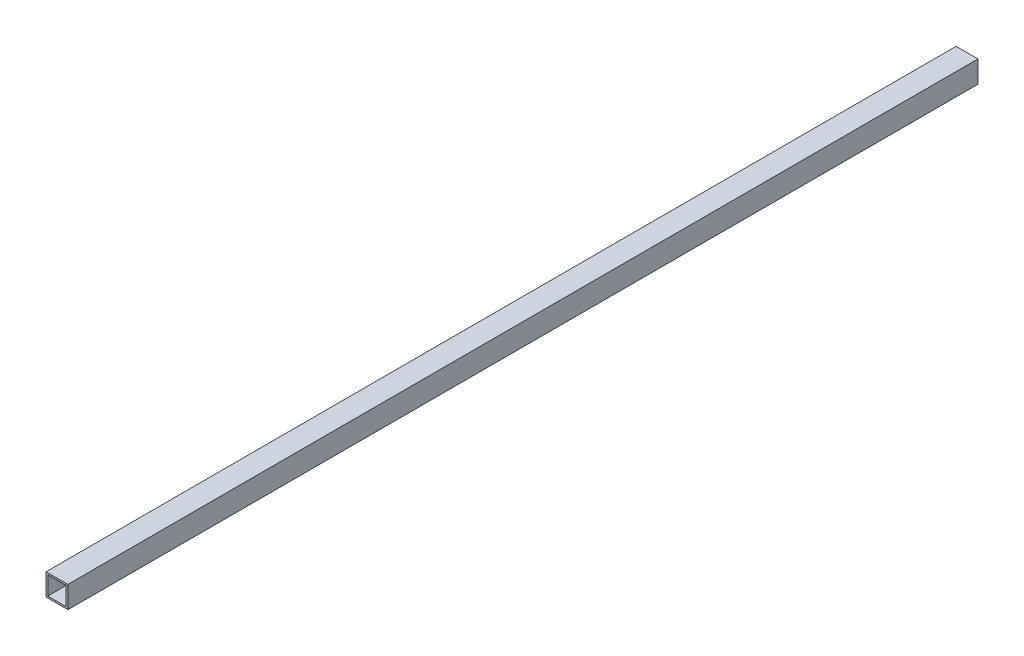
ISO-10303-21;
HEADER;
FILE_DESCRIPTION(('STEP AP214'),'2;1');
FILE_NAME('part.step','',(''),(''),'','','');
FILE_SCHEMA(('AUTOMOTIVE_DESIGN { 1 0 10303 214 1 1 1 1 }'));
ENDSEC;
DATA;
#1=APPLICATION_CONTEXT('core data for automotive mechanical design processes');
#2=APPLICATION_PROTOCOL_DEFINITION('international standard','automotive_design',2000,#1);
#3=PRODUCT_CONTEXT('',#1,'mechanical');
#4=PRODUCT('Part','Part','',(#3));
#5=PRODUCT_RELATED_PRODUCT_CATEGORY('part','',(#4));
#6=PRODUCT_DEFINITION_FORMATION('','',#4);
#7=PRODUCT_DEFINITION_CONTEXT('part definition',#1,'design');
#8=PRODUCT_DEFINITION('design','',#6,#7);
#9=PRODUCT_DEFINITION_SHAPE('','',#8);
#10=(LENGTH_UNIT() NAMED_UNIT(*) SI_UNIT(.MILLI.,.METRE.));
#11=(NAMED_UNIT(*) PLANE_ANGLE_UNIT() SI_UNIT($,.RADIAN.));
#12=(NAMED_UNIT(*) SI_UNIT($,.STERADIAN.) SOLID_ANGLE_UNIT());
#13=UNCERTAINTY_MEASURE_WITH_UNIT(LENGTH_MEASURE(1.E-05),#10,'distance_accuracy_value','');
#14=(GEOMETRIC_REPRESENTATION_CONTEXT(3) GLOBAL_UNCERTAINTY_ASSIGNED_CONTEXT((#13)) GLOBAL_UNIT_ASSIGNED_CONTEXT((#10,
#11,#12)) REPRESENTATION_CONTEXT('',''));
#15=CARTESIAN_POINT('',(0.,0.,0.));
#16=DIRECTION('',(0.,0.,1.));
#17=DIRECTION('',(1.,0.,0.));
#18=AXIS2_PLACEMENT_3D('',#15,#16,#17);
#19=CARTESIAN_POINT('',(0.,0.,520.));
#20=DIRECTION('',(0.,0.,-1.));
#21=DIRECTION('',(-1.,0.,0.));
#22=AXIS2_PLACEMENT_3D('',#19,#20,#21);
#23=PLANE('',#22);
#24=DIRECTION('',(0.,1.,0.));
#25=VECTOR('',#24,1.);
#26=CARTESIAN_POINT('',(12.5,-12.5,520.));
#27=LINE('',#26,#25);
#28=CARTESIAN_POINT('',(12.5,-12.5,520.));
#29=VERTEX_POINT('',#28);
#30=CARTESIAN_POINT('',(12.5,12.5,520.));
#31=VERTEX_POINT('',#30);
#32=EDGE_CURVE('E137',#29,#31,#27,.T.);
#33=ORIENTED_EDGE('',*,*,#32,.T.);
#34=DIRECTION('',(-1.,0.,0.));
#35=VECTOR('',#34,1.);
#36=CARTESIAN_POINT('',(-12.5,12.5,520.));
#37=LINE('',#36,#35);
#38=CARTESIAN_POINT('',(-12.5,12.5,520.));
#39=VERTEX_POINT('',#38);
#40=EDGE_CURVE('E140',#31,#39,#37,.T.);
#41=ORIENTED_EDGE('',*,*,#40,.T.);
#42=DIRECTION('',(0.,-1.,0.));
#43=VECTOR('',#42,1.);
#44=CARTESIAN_POINT('',(-12.5,-12.5,520.));
#45=LINE('',#44,#43);
#46=CARTESIAN_POINT('',(-12.5,-12.5,520.));
#47=VERTEX_POINT('',#46);
#48=EDGE_CURVE('E143',#39,#47,#45,.T.);
#49=ORIENTED_EDGE('',*,*,#48,.T.);
#50=DIRECTION('',(1.,0.,0.));
#51=VECTOR('',#50,1.);
#52=CARTESIAN_POINT('',(-12.5,-12.5,520.));
#53=LINE('',#52,#51);
#54=EDGE_CURVE('E145',#47,#29,#53,.T.);
#55=ORIENTED_EDGE('',*,*,#54,.T.);
#56=EDGE_LOOP('',(#33,#41,#49,#55));
#57=FACE_BOUND('',#56,.T.);
#58=DIRECTION('',(0.,1.,0.));
#59=VECTOR('',#58,1.);
#60=CARTESIAN_POINT('',(10.5,-10.5,520.));
#61=LINE('',#60,#59);
#62=CARTESIAN_POINT('',(10.5,-10.5,520.));
#63=VERTEX_POINT('',#62);
#64=CARTESIAN_POINT('',(10.5,10.5,520.));
#65=VERTEX_POINT('',#64);
#66=EDGE_CURVE('E101',#63,#65,#61,.T.);
#67=ORIENTED_EDGE('',*,*,#66,.F.);
#68=DIRECTION('',(1.,0.,0.));
#69=VECTOR('',#68,1.);
#70=CARTESIAN_POINT('',(-10.5,-10.5,520.));
#71=LINE('',#70,#69);
#72=CARTESIAN_POINT('',(-10.5,-10.5,520.));
#73=VERTEX_POINT('',#72);
#74=EDGE_CURVE('E123',#73,#63,#71,.T.);
#75=ORIENTED_EDGE('',*,*,#74,.F.);
#76=DIRECTION('',(0.,-1.,0.));
#77=VECTOR('',#76,1.);
#78=CARTESIAN_POINT('',(-10.5,-10.5,520.));
#79=LINE('',#78,#77);
#80=CARTESIAN_POINT('',(-10.5,10.5,520.));
#81=VERTEX_POINT('',#80);
#82=EDGE_CURVE('E121',#81,#73,#79,.T.);
#83=ORIENTED_EDGE('',*,*,#82,.F.);
#84=DIRECTION('',(-1.,0.,0.));
#85=VECTOR('',#84,1.);
#86=CARTESIAN_POINT('',(-10.5,10.5,520.));
#87=LINE('',#86,#85);
#88=EDGE_CURVE('E109',#65,#81,#87,.T.);
#89=ORIENTED_EDGE('',*,*,#88,.F.);
#90=EDGE_LOOP('',(#67,#75,#83,#89));
#91=FACE_BOUND('',#90,.T.);
#92=ADVANCED_FACE('F36',(#57,#91),#23,.F.);
#93=CARTESIAN_POINT('',(0.,0.,-520.));
#94=DIRECTION('',(0.,0.,-1.));
#95=DIRECTION('',(-1.,0.,0.));
#96=AXIS2_PLACEMENT_3D('',#93,#94,#95);
#97=PLANE('',#96);
#98=DIRECTION('',(0.,1.,0.));
#99=VECTOR('',#98,1.);
#100=CARTESIAN_POINT('',(12.5,-12.5,-520.));
#101=LINE('',#100,#99);
#102=CARTESIAN_POINT('',(12.5,-12.5,-520.));
#103=VERTEX_POINT('',#102);
#104=CARTESIAN_POINT('',(12.5,12.5,-520.));
#105=VERTEX_POINT('',#104);
#106=EDGE_CURVE('E117',#103,#105,#101,.T.);
#107=ORIENTED_EDGE('',*,*,#106,.F.);
#108=DIRECTION('',(1.,0.,0.));
#109=VECTOR('',#108,1.);
#110=CARTESIAN_POINT('',(-12.5,-12.5,-520.));
#111=LINE('',#110,#109);
#112=CARTESIAN_POINT('',(-12.5,-12.5,-520.));
#113=VERTEX_POINT('',#112);
#114=EDGE_CURVE('E141',#113,#103,#111,.T.);
#115=ORIENTED_EDGE('',*,*,#114,.F.);
#116=DIRECTION('',(0.,-1.,0.));
#117=VECTOR('',#116,1.);
#118=CARTESIAN_POINT('',(-12.5,-12.5,-520.));
#119=LINE('',#118,#117);
#120=CARTESIAN_POINT('',(-12.5,12.5,-520.));
#121=VERTEX_POINT('',#120);
#122=EDGE_CURVE('E152',#121,#113,#119,.T.);
#123=ORIENTED_EDGE('',*,*,#122,.F.);
#124=DIRECTION('',(-1.,0.,0.));
#125=VECTOR('',#124,1.);
#126=CARTESIAN_POINT('',(-12.5,12.5,-520.));
#127=LINE('',#126,#125);
#128=EDGE_CURVE('E150',#105,#121,#127,.T.);
#129=ORIENTED_EDGE('',*,*,#128,.F.);
#130=EDGE_LOOP('',(#107,#115,#123,#129));
#131=FACE_BOUND('',#130,.T.);
#132=DIRECTION('',(1.,0.,0.));
#133=VECTOR('',#132,1.);
#134=CARTESIAN_POINT('',(-10.5,-10.5,-520.));
#135=LINE('',#134,#133);
#136=CARTESIAN_POINT('',(-10.5,-10.5,-520.));
#137=VERTEX_POINT('',#136);
#138=CARTESIAN_POINT('',(10.5,-10.5,-520.));
#139=VERTEX_POINT('',#138);
#140=EDGE_CURVE('E110',#137,#139,#135,.T.);
#141=ORIENTED_EDGE('',*,*,#140,.T.);
#142=DIRECTION('',(0.,1.,0.));
#143=VECTOR('',#142,1.);
#144=CARTESIAN_POINT('',(10.5,-10.5,-520.));
#145=LINE('',#144,#143);
#146=CARTESIAN_POINT('',(10.5,10.5,-520.));
#147=VERTEX_POINT('',#146);
#148=EDGE_CURVE('E59',#139,#147,#145,.T.);
#149=ORIENTED_EDGE('',*,*,#148,.T.);
#150=DIRECTION('',(-1.,0.,0.));
#151=VECTOR('',#150,1.);
#152=CARTESIAN_POINT('',(-10.5,10.5,-520.));
#153=LINE('',#152,#151);
#154=CARTESIAN_POINT('',(-10.5,10.5,-520.));
#155=VERTEX_POINT('',#154);
#156=EDGE_CURVE('E116',#147,#155,#153,.T.);
#157=ORIENTED_EDGE('',*,*,#156,.T.);
#158=DIRECTION('',(0.,-1.,0.));
#159=VECTOR('',#158,1.);
#160=CARTESIAN_POINT('',(-10.5,-10.5,-520.));
#161=LINE('',#160,#159);
#162=EDGE_CURVE('E129',#155,#137,#161,.T.);
#163=ORIENTED_EDGE('',*,*,#162,.T.);
#164=EDGE_LOOP('',(#141,#149,#157,#163));
#165=FACE_BOUND('',#164,.T.);
#166=ADVANCED_FACE('F170',(#131,#165),#97,.T.);
#167=CARTESIAN_POINT('',(12.5,-12.5,520.));
#168=DIRECTION('',(-1.,0.,0.));
#169=DIRECTION('',(0.,0.,1.));
#170=AXIS2_PLACEMENT_3D('',#167,#168,#169);
#171=PLANE('',#170);
#172=ORIENTED_EDGE('',*,*,#106,.T.);
#173=DIRECTION('',(0.,0.,-1.));
#174=VECTOR('',#173,1.);
#175=CARTESIAN_POINT('',(12.5,12.5,520.));
#176=LINE('',#175,#174);
#177=EDGE_CURVE('E11',#31,#105,#176,.T.);
#178=ORIENTED_EDGE('',*,*,#177,.F.);
#179=ORIENTED_EDGE('',*,*,#32,.F.);
#180=DIRECTION('',(0.,0.,-1.));
#181=VECTOR('',#180,1.);
#182=CARTESIAN_POINT('',(12.5,-12.5,520.));
#183=LINE('',#182,#181);
#184=EDGE_CURVE('E147',#29,#103,#183,.T.);
#185=ORIENTED_EDGE('',*,*,#184,.T.);
#186=EDGE_LOOP('',(#172,#178,#179,#185));
#187=FACE_BOUND('',#186,.T.);
#188=ADVANCED_FACE('F38',(#187),#171,.F.);
#189=CARTESIAN_POINT('',(-12.5,12.5,520.));
#190=DIRECTION('',(0.,-1.,0.));
#191=DIRECTION('',(0.,0.,-1.));
#192=AXIS2_PLACEMENT_3D('',#189,#190,#191);
#193=PLANE('',#192);
#194=ORIENTED_EDGE('',*,*,#128,.T.);
#195=DIRECTION('',(0.,0.,-1.));
#196=VECTOR('',#195,1.);
#197=CARTESIAN_POINT('',(-12.5,12.5,520.));
#198=LINE('',#197,#196);
#199=EDGE_CURVE('E44',#39,#121,#198,.T.);
#200=ORIENTED_EDGE('',*,*,#199,.F.);
#201=ORIENTED_EDGE('',*,*,#40,.F.);
#202=ORIENTED_EDGE('',*,*,#177,.T.);
#203=EDGE_LOOP('',(#194,#200,#201,#202));
#204=FACE_BOUND('',#203,.T.);
#205=ADVANCED_FACE('F180',(#204),#193,.F.);
#206=CARTESIAN_POINT('',(-12.5,-12.5,520.));
#207=DIRECTION('',(1.,0.,0.));
#208=DIRECTION('',(0.,0.,-1.));
#209=AXIS2_PLACEMENT_3D('',#206,#207,#208);
#210=PLANE('',#209);
#211=ORIENTED_EDGE('',*,*,#122,.T.);
#212=DIRECTION('',(0.,0.,-1.));
#213=VECTOR('',#212,1.);
#214=CARTESIAN_POINT('',(-12.5,-12.5,520.));
#215=LINE('',#214,#213);
#216=EDGE_CURVE('E157',#47,#113,#215,.T.);
#217=ORIENTED_EDGE('',*,*,#216,.F.);
#218=ORIENTED_EDGE('',*,*,#48,.F.);
#219=ORIENTED_EDGE('',*,*,#199,.T.);
#220=EDGE_LOOP('',(#211,#217,#218,#219));
#221=FACE_BOUND('',#220,.T.);
#222=ADVANCED_FACE('F164',(#221),#210,.F.);
#223=CARTESIAN_POINT('',(-12.5,-12.5,520.));
#224=DIRECTION('',(0.,1.,0.));
#225=DIRECTION('',(0.,0.,1.));
#226=AXIS2_PLACEMENT_3D('',#223,#224,#225);
#227=PLANE('',#226);
#228=ORIENTED_EDGE('',*,*,#114,.T.);
#229=ORIENTED_EDGE('',*,*,#184,.F.);
#230=ORIENTED_EDGE('',*,*,#54,.F.);
#231=ORIENTED_EDGE('',*,*,#216,.T.);
#232=EDGE_LOOP('',(#228,#229,#230,#231));
#233=FACE_BOUND('',#232,.T.);
#234=ADVANCED_FACE('F174',(#233),#227,.F.);
#235=CARTESIAN_POINT('',(10.5,-10.5,520.));
#236=DIRECTION('',(-1.,0.,0.));
#237=DIRECTION('',(0.,0.,1.));
#238=AXIS2_PLACEMENT_3D('',#235,#236,#237);
#239=PLANE('',#238);
#240=ORIENTED_EDGE('',*,*,#148,.F.);
#241=DIRECTION('',(0.,0.,-1.));
#242=VECTOR('',#241,1.);
#243=CARTESIAN_POINT('',(10.5,-10.5,520.));
#244=LINE('',#243,#242);
#245=EDGE_CURVE('E105',#63,#139,#244,.T.);
#246=ORIENTED_EDGE('',*,*,#245,.F.);
#247=ORIENTED_EDGE('',*,*,#66,.T.);
#248=DIRECTION('',(0.,0.,-1.));
#249=VECTOR('',#248,1.);
#250=CARTESIAN_POINT('',(10.5,10.5,520.));
#251=LINE('',#250,#249);
#252=EDGE_CURVE('E104',#65,#147,#251,.T.);
#253=ORIENTED_EDGE('',*,*,#252,.T.);
#254=EDGE_LOOP('',(#240,#246,#247,#253));
#255=FACE_BOUND('',#254,.T.);
#256=ADVANCED_FACE('F103',(#255),#239,.T.);
#257=CARTESIAN_POINT('',(-10.5,10.5,520.));
#258=DIRECTION('',(0.,-1.,0.));
#259=DIRECTION('',(0.,0.,-1.));
#260=AXIS2_PLACEMENT_3D('',#257,#258,#259);
#261=PLANE('',#260);
#262=ORIENTED_EDGE('',*,*,#156,.F.);
#263=ORIENTED_EDGE('',*,*,#252,.F.);
#264=ORIENTED_EDGE('',*,*,#88,.T.);
#265=DIRECTION('',(0.,0.,-1.));
#266=VECTOR('',#265,1.);
#267=CARTESIAN_POINT('',(-10.5,10.5,520.));
#268=LINE('',#267,#266);
#269=EDGE_CURVE('E118',#81,#155,#268,.T.);
#270=ORIENTED_EDGE('',*,*,#269,.T.);
#271=EDGE_LOOP('',(#262,#263,#264,#270));
#272=FACE_BOUND('',#271,.T.);
#273=ADVANCED_FACE('F113',(#272),#261,.T.);
#274=CARTESIAN_POINT('',(-10.5,-10.5,520.));
#275=DIRECTION('',(1.,0.,0.));
#276=DIRECTION('',(0.,0.,-1.));
#277=AXIS2_PLACEMENT_3D('',#274,#275,#276);
#278=PLANE('',#277);
#279=ORIENTED_EDGE('',*,*,#162,.F.);
#280=ORIENTED_EDGE('',*,*,#269,.F.);
#281=ORIENTED_EDGE('',*,*,#82,.T.);
#282=DIRECTION('',(0.,0.,-1.));
#283=VECTOR('',#282,1.);
#284=CARTESIAN_POINT('',(-10.5,-10.5,520.));
#285=LINE('',#284,#283);
#286=EDGE_CURVE('E51',#73,#137,#285,.T.);
#287=ORIENTED_EDGE('',*,*,#286,.T.);
#288=EDGE_LOOP('',(#279,#280,#281,#287));
#289=FACE_BOUND('',#288,.T.);
#290=ADVANCED_FACE('F203',(#289),#278,.T.);
#291=CARTESIAN_POINT('',(-10.5,-10.5,520.));
#292=DIRECTION('',(0.,1.,0.));
#293=DIRECTION('',(0.,0.,1.));
#294=AXIS2_PLACEMENT_3D('',#291,#292,#293);
#295=PLANE('',#294);
#296=ORIENTED_EDGE('',*,*,#140,.F.);
#297=ORIENTED_EDGE('',*,*,#286,.F.);
#298=ORIENTED_EDGE('',*,*,#74,.T.);
#299=ORIENTED_EDGE('',*,*,#245,.T.);
#300=EDGE_LOOP('',(#296,#297,#298,#299));
#301=FACE_BOUND('',#300,.T.);
#302=ADVANCED_FACE('F207',(#301),#295,.T.);
#303=CLOSED_SHELL('',(#92,#166,#188,#205,#222,#234,#256,#273,#290,#302));
#304=MANIFOLD_SOLID_BREP('B2',#303);
#305=ADVANCED_BREP_SHAPE_REPRESENTATION('',(#18,#304),#14);
#306=SHAPE_DEFINITION_REPRESENTATION(#9,#305);
ENDSEC;
END-ISO-10303-21;
